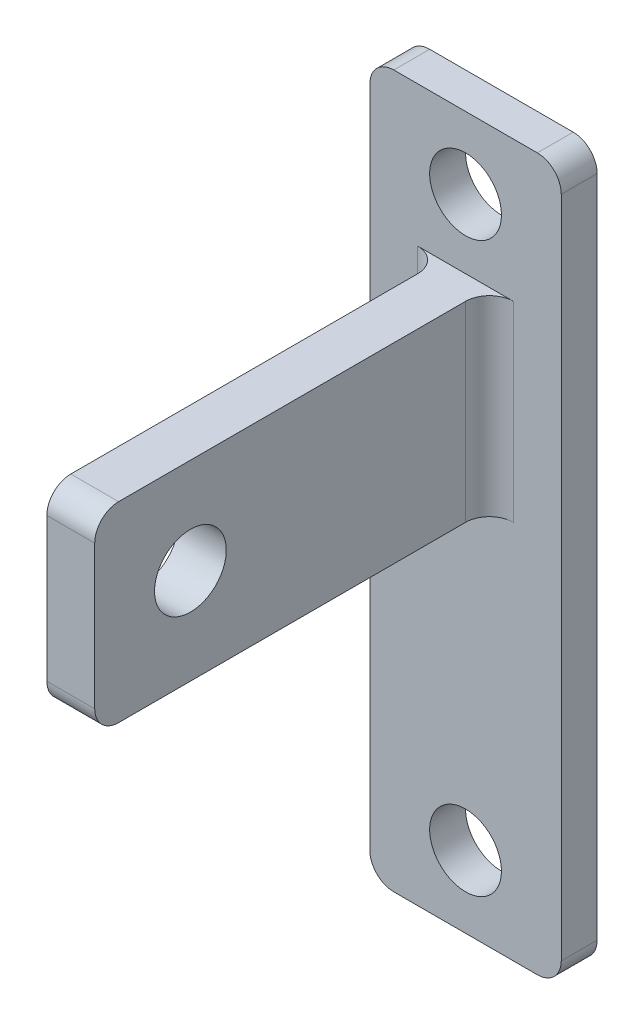
ISO-10303-21;
HEADER;
FILE_DESCRIPTION(('STEP AP214'),'2;1');
FILE_NAME('part.step','',(''),(''),'','','');
FILE_SCHEMA(('AUTOMOTIVE_DESIGN { 1 0 10303 214 1 1 1 1 }'));
ENDSEC;
DATA;
#1=APPLICATION_CONTEXT('core data for automotive mechanical design processes');
#2=APPLICATION_PROTOCOL_DEFINITION('international standard','automotive_design',2000,#1);
#3=PRODUCT_CONTEXT('',#1,'mechanical');
#4=PRODUCT('Part','Part','',(#3));
#5=PRODUCT_RELATED_PRODUCT_CATEGORY('part','',(#4));
#6=PRODUCT_DEFINITION_FORMATION('','',#4);
#7=PRODUCT_DEFINITION_CONTEXT('part definition',#1,'design');
#8=PRODUCT_DEFINITION('design','',#6,#7);
#9=PRODUCT_DEFINITION_SHAPE('','',#8);
#10=(LENGTH_UNIT() NAMED_UNIT(*) SI_UNIT(.MILLI.,.METRE.));
#11=(NAMED_UNIT(*) PLANE_ANGLE_UNIT() SI_UNIT($,.RADIAN.));
#12=(NAMED_UNIT(*) SI_UNIT($,.STERADIAN.) SOLID_ANGLE_UNIT());
#13=UNCERTAINTY_MEASURE_WITH_UNIT(LENGTH_MEASURE(1.E-05),#10,'distance_accuracy_value','');
#14=(GEOMETRIC_REPRESENTATION_CONTEXT(3) GLOBAL_UNCERTAINTY_ASSIGNED_CONTEXT((#13)) GLOBAL_UNIT_ASSIGNED_CONTEXT((#10,
#11,#12)) REPRESENTATION_CONTEXT('',''));
#15=CARTESIAN_POINT('',(0.,0.,0.));
#16=DIRECTION('',(0.,0.,1.));
#17=DIRECTION('',(1.,0.,0.));
#18=AXIS2_PLACEMENT_3D('',#15,#16,#17);
#19=CARTESIAN_POINT('',(0.,0.,1.5));
#20=DIRECTION('',(0.,0.,-1.));
#21=DIRECTION('',(-1.,0.,0.));
#22=AXIS2_PLACEMENT_3D('',#19,#20,#21);
#23=PLANE('',#22);
#24=CARTESIAN_POINT('',(0.,-11.875,1.5));
#25=DIRECTION('',(0.,0.,1.));
#26=DIRECTION('',(1.,0.,0.));
#27=AXIS2_PLACEMENT_3D('',#24,#25,#26);
#28=CIRCLE('',#27,1.5);
#29=CARTESIAN_POINT('',(1.5,-11.875,1.5));
#30=VERTEX_POINT('',#29);
#31=EDGE_CURVE('E264',#30,#30,#28,.T.);
#32=ORIENTED_EDGE('',*,*,#31,.F.);
#33=EDGE_LOOP('',(#32));
#34=FACE_BOUND('',#33,.T.);
#35=DIRECTION('',(1.,0.,0.));
#36=VECTOR('',#35,1.);
#37=CARTESIAN_POINT('',(-4.,-14.875,1.5));
#38=LINE('',#37,#36);
#39=CARTESIAN_POINT('',(-3.,-14.875,1.5));
#40=VERTEX_POINT('',#39);
#41=CARTESIAN_POINT('',(3.,-14.875,1.5));
#42=VERTEX_POINT('',#41);
#43=EDGE_CURVE('E171',#40,#42,#38,.T.);
#44=ORIENTED_EDGE('',*,*,#43,.T.);
#45=CARTESIAN_POINT('',(3.,-13.875,1.5));
#46=DIRECTION('',(0.,0.,-1.));
#47=DIRECTION('',(-1.,0.,0.));
#48=AXIS2_PLACEMENT_3D('',#45,#46,#47);
#49=CIRCLE('',#48,1.);
#50=CARTESIAN_POINT('',(4.,-13.875,1.5));
#51=VERTEX_POINT('',#50);
#52=EDGE_CURVE('E216',#42,#51,#49,.F.);
#53=ORIENTED_EDGE('',*,*,#52,.T.);
#54=DIRECTION('',(0.,1.,0.));
#55=VECTOR('',#54,1.);
#56=CARTESIAN_POINT('',(4.,-14.875,1.5));
#57=LINE('',#56,#55);
#58=CARTESIAN_POINT('',(4.,13.875,1.5));
#59=VERTEX_POINT('',#58);
#60=EDGE_CURVE('E276',#51,#59,#57,.T.);
#61=ORIENTED_EDGE('',*,*,#60,.T.);
#62=CARTESIAN_POINT('',(3.,13.875,1.5));
#63=DIRECTION('',(0.,0.,-1.));
#64=DIRECTION('',(-1.,0.,0.));
#65=AXIS2_PLACEMENT_3D('',#62,#63,#64);
#66=CIRCLE('',#65,1.);
#67=CARTESIAN_POINT('',(3.,14.875,1.5));
#68=VERTEX_POINT('',#67);
#69=EDGE_CURVE('E212',#59,#68,#66,.F.);
#70=ORIENTED_EDGE('',*,*,#69,.T.);
#71=DIRECTION('',(-1.,0.,0.));
#72=VECTOR('',#71,1.);
#73=CARTESIAN_POINT('',(-4.,14.875,1.5));
#74=LINE('',#73,#72);
#75=CARTESIAN_POINT('',(-3.,14.875,1.5));
#76=VERTEX_POINT('',#75);
#77=EDGE_CURVE('E279',#68,#76,#74,.T.);
#78=ORIENTED_EDGE('',*,*,#77,.T.);
#79=CARTESIAN_POINT('',(-3.,13.875,1.5));
#80=DIRECTION('',(0.,0.,-1.));
#81=DIRECTION('',(-1.,0.,0.));
#82=AXIS2_PLACEMENT_3D('',#79,#80,#81);
#83=CIRCLE('',#82,1.);
#84=CARTESIAN_POINT('',(-4.,13.875,1.5));
#85=VERTEX_POINT('',#84);
#86=EDGE_CURVE('E210',#76,#85,#83,.F.);
#87=ORIENTED_EDGE('',*,*,#86,.T.);
#88=DIRECTION('',(0.,-1.,0.));
#89=VECTOR('',#88,1.);
#90=CARTESIAN_POINT('',(-4.,-14.875,1.5));
#91=LINE('',#90,#89);
#92=CARTESIAN_POINT('',(-4.,-13.875,1.5));
#93=VERTEX_POINT('',#92);
#94=EDGE_CURVE('E176',#85,#93,#91,.T.);
#95=ORIENTED_EDGE('',*,*,#94,.T.);
#96=CARTESIAN_POINT('',(-3.,-13.875,1.5));
#97=DIRECTION('',(0.,0.,-1.));
#98=DIRECTION('',(-1.,0.,0.));
#99=AXIS2_PLACEMENT_3D('',#96,#97,#98);
#100=CIRCLE('',#99,1.);
#101=EDGE_CURVE('E214',#93,#40,#100,.F.);
#102=ORIENTED_EDGE('',*,*,#101,.T.);
#103=EDGE_LOOP('',(#44,#53,#61,#70,#78,#87,#95,#102));
#104=FACE_BOUND('',#103,.T.);
#105=CARTESIAN_POINT('',(0.,11.875,1.5));
#106=DIRECTION('',(0.,0.,1.));
#107=DIRECTION('',(1.,0.,0.));
#108=AXIS2_PLACEMENT_3D('',#105,#106,#107);
#109=CIRCLE('',#108,1.5);
#110=CARTESIAN_POINT('',(1.5,11.875,1.5));
#111=VERTEX_POINT('',#110);
#112=EDGE_CURVE('E270',#111,#111,#109,.T.);
#113=ORIENTED_EDGE('',*,*,#112,.F.);
#114=EDGE_LOOP('',(#113));
#115=FACE_BOUND('',#114,.T.);
#116=DIRECTION('',(1.,0.,0.));
#117=VECTOR('',#116,1.);
#118=CARTESIAN_POINT('',(-1.,1.,1.5));
#119=LINE('',#118,#117);
#120=CARTESIAN_POINT('',(-2.,1.,1.5));
#121=VERTEX_POINT('',#120);
#122=CARTESIAN_POINT('',(2.,1.,1.5));
#123=VERTEX_POINT('',#122);
#124=EDGE_CURVE('E257',#121,#123,#119,.T.);
#125=ORIENTED_EDGE('',*,*,#124,.F.);
#126=DIRECTION('',(0.,-1.,0.));
#127=VECTOR('',#126,1.);
#128=CARTESIAN_POINT('',(-2.,9.,1.5));
#129=LINE('',#128,#127);
#130=CARTESIAN_POINT('',(-2.,9.,1.5));
#131=VERTEX_POINT('',#130);
#132=EDGE_CURVE('E164',#121,#131,#129,.F.);
#133=ORIENTED_EDGE('',*,*,#132,.T.);
#134=DIRECTION('',(-1.,0.,0.));
#135=VECTOR('',#134,1.);
#136=CARTESIAN_POINT('',(-1.,9.,1.5));
#137=LINE('',#136,#135);
#138=CARTESIAN_POINT('',(2.,9.,1.5));
#139=VERTEX_POINT('',#138);
#140=EDGE_CURVE('E394',#139,#131,#137,.T.);
#141=ORIENTED_EDGE('',*,*,#140,.F.);
#142=DIRECTION('',(0.,1.,0.));
#143=VECTOR('',#142,1.);
#144=CARTESIAN_POINT('',(2.,1.,1.5));
#145=LINE('',#144,#143);
#146=EDGE_CURVE('E170',#139,#123,#145,.F.);
#147=ORIENTED_EDGE('',*,*,#146,.T.);
#148=EDGE_LOOP('',(#125,#133,#141,#147));
#149=FACE_BOUND('',#148,.T.);
#150=ADVANCED_FACE('F37',(#34,#104,#115,#149),#23,.F.);
#151=CARTESIAN_POINT('',(0.,0.,0.));
#152=DIRECTION('',(0.,0.,-1.));
#153=DIRECTION('',(-1.,0.,0.));
#154=AXIS2_PLACEMENT_3D('',#151,#152,#153);
#155=PLANE('',#154);
#156=CARTESIAN_POINT('',(0.,11.875,0.));
#157=DIRECTION('',(0.,0.,1.));
#158=DIRECTION('',(1.,0.,0.));
#159=AXIS2_PLACEMENT_3D('',#156,#157,#158);
#160=CIRCLE('',#159,1.5);
#161=CARTESIAN_POINT('',(1.5,11.875,0.));
#162=VERTEX_POINT('',#161);
#163=EDGE_CURVE('E267',#162,#162,#160,.T.);
#164=ORIENTED_EDGE('',*,*,#163,.T.);
#165=EDGE_LOOP('',(#164));
#166=FACE_BOUND('',#165,.T.);
#167=DIRECTION('',(0.,1.,0.));
#168=VECTOR('',#167,1.);
#169=CARTESIAN_POINT('',(4.,-14.875,0.));
#170=LINE('',#169,#168);
#171=CARTESIAN_POINT('',(4.,-13.875,0.));
#172=VERTEX_POINT('',#171);
#173=CARTESIAN_POINT('',(4.,13.875,0.));
#174=VERTEX_POINT('',#173);
#175=EDGE_CURVE('E273',#172,#174,#170,.T.);
#176=ORIENTED_EDGE('',*,*,#175,.F.);
#177=CARTESIAN_POINT('',(3.,-13.875,0.));
#178=DIRECTION('',(0.,0.,-1.));
#179=DIRECTION('',(-1.,0.,0.));
#180=AXIS2_PLACEMENT_3D('',#177,#178,#179);
#181=CIRCLE('',#180,1.);
#182=CARTESIAN_POINT('',(3.,-14.875,0.));
#183=VERTEX_POINT('',#182);
#184=EDGE_CURVE('E203',#172,#183,#181,.T.);
#185=ORIENTED_EDGE('',*,*,#184,.T.);
#186=DIRECTION('',(1.,0.,0.));
#187=VECTOR('',#186,1.);
#188=CARTESIAN_POINT('',(-4.,-14.875,0.));
#189=LINE('',#188,#187);
#190=CARTESIAN_POINT('',(-3.,-14.875,0.));
#191=VERTEX_POINT('',#190);
#192=EDGE_CURVE('E179',#191,#183,#189,.T.);
#193=ORIENTED_EDGE('',*,*,#192,.F.);
#194=CARTESIAN_POINT('',(-3.,-13.875,0.));
#195=DIRECTION('',(0.,0.,-1.));
#196=DIRECTION('',(-1.,0.,0.));
#197=AXIS2_PLACEMENT_3D('',#194,#195,#196);
#198=CIRCLE('',#197,1.);
#199=CARTESIAN_POINT('',(-4.,-13.875,0.));
#200=VERTEX_POINT('',#199);
#201=EDGE_CURVE('E201',#191,#200,#198,.T.);
#202=ORIENTED_EDGE('',*,*,#201,.T.);
#203=DIRECTION('',(0.,-1.,0.));
#204=VECTOR('',#203,1.);
#205=CARTESIAN_POINT('',(-4.,-14.875,0.));
#206=LINE('',#205,#204);
#207=CARTESIAN_POINT('',(-4.,13.875,0.));
#208=VERTEX_POINT('',#207);
#209=EDGE_CURVE('E288',#208,#200,#206,.T.);
#210=ORIENTED_EDGE('',*,*,#209,.F.);
#211=CARTESIAN_POINT('',(-3.,13.875,0.));
#212=DIRECTION('',(0.,0.,-1.));
#213=DIRECTION('',(-1.,0.,0.));
#214=AXIS2_PLACEMENT_3D('',#211,#212,#213);
#215=CIRCLE('',#214,1.);
#216=CARTESIAN_POINT('',(-3.,14.875,0.));
#217=VERTEX_POINT('',#216);
#218=EDGE_CURVE('E197',#208,#217,#215,.T.);
#219=ORIENTED_EDGE('',*,*,#218,.T.);
#220=DIRECTION('',(-1.,0.,0.));
#221=VECTOR('',#220,1.);
#222=CARTESIAN_POINT('',(-4.,14.875,0.));
#223=LINE('',#222,#221);
#224=CARTESIAN_POINT('',(3.,14.875,0.));
#225=VERTEX_POINT('',#224);
#226=EDGE_CURVE('E286',#225,#217,#223,.T.);
#227=ORIENTED_EDGE('',*,*,#226,.F.);
#228=CARTESIAN_POINT('',(3.,13.875,0.));
#229=DIRECTION('',(0.,0.,-1.));
#230=DIRECTION('',(-1.,0.,0.));
#231=AXIS2_PLACEMENT_3D('',#228,#229,#230);
#232=CIRCLE('',#231,1.);
#233=EDGE_CURVE('E199',#225,#174,#232,.T.);
#234=ORIENTED_EDGE('',*,*,#233,.T.);
#235=EDGE_LOOP('',(#176,#185,#193,#202,#210,#219,#227,#234));
#236=FACE_BOUND('',#235,.T.);
#237=CARTESIAN_POINT('',(0.,-11.875,0.));
#238=DIRECTION('',(0.,0.,1.));
#239=DIRECTION('',(1.,0.,0.));
#240=AXIS2_PLACEMENT_3D('',#237,#238,#239);
#241=CIRCLE('',#240,1.5);
#242=CARTESIAN_POINT('',(1.5,-11.875,0.));
#243=VERTEX_POINT('',#242);
#244=EDGE_CURVE('E263',#243,#243,#241,.T.);
#245=ORIENTED_EDGE('',*,*,#244,.T.);
#246=EDGE_LOOP('',(#245));
#247=FACE_BOUND('',#246,.T.);
#248=ADVANCED_FACE('F330',(#166,#236,#247),#155,.T.);
#249=CARTESIAN_POINT('',(4.,-14.875,1.5));
#250=DIRECTION('',(-1.,0.,0.));
#251=DIRECTION('',(0.,-1.,0.));
#252=AXIS2_PLACEMENT_3D('',#249,#250,#251);
#253=PLANE('',#252);
#254=ORIENTED_EDGE('',*,*,#60,.F.);
#255=DIRECTION('',(0.,0.,-1.));
#256=VECTOR('',#255,1.);
#257=CARTESIAN_POINT('',(4.,-13.875,1.5));
#258=LINE('',#257,#256);
#259=EDGE_CURVE('E194',#51,#172,#258,.T.);
#260=ORIENTED_EDGE('',*,*,#259,.T.);
#261=ORIENTED_EDGE('',*,*,#175,.T.);
#262=DIRECTION('',(0.,0.,-1.));
#263=VECTOR('',#262,1.);
#264=CARTESIAN_POINT('',(4.,13.875,1.5));
#265=LINE('',#264,#263);
#266=EDGE_CURVE('E192',#174,#59,#265,.F.);
#267=ORIENTED_EDGE('',*,*,#266,.T.);
#268=EDGE_LOOP('',(#254,#260,#261,#267));
#269=FACE_BOUND('',#268,.T.);
#270=ADVANCED_FACE('F310',(#269),#253,.F.);
#271=CARTESIAN_POINT('',(-4.,14.875,1.5));
#272=DIRECTION('',(0.,-1.,0.));
#273=DIRECTION('',(0.,0.,-1.));
#274=AXIS2_PLACEMENT_3D('',#271,#272,#273);
#275=PLANE('',#274);
#276=ORIENTED_EDGE('',*,*,#77,.F.);
#277=DIRECTION('',(0.,0.,-1.));
#278=VECTOR('',#277,1.);
#279=CARTESIAN_POINT('',(3.,14.875,1.5));
#280=LINE('',#279,#278);
#281=EDGE_CURVE('E225',#68,#225,#280,.T.);
#282=ORIENTED_EDGE('',*,*,#281,.T.);
#283=ORIENTED_EDGE('',*,*,#226,.T.);
#284=DIRECTION('',(0.,0.,-1.));
#285=VECTOR('',#284,1.);
#286=CARTESIAN_POINT('',(-3.,14.875,1.5));
#287=LINE('',#286,#285);
#288=EDGE_CURVE('E223',#217,#76,#287,.F.);
#289=ORIENTED_EDGE('',*,*,#288,.T.);
#290=EDGE_LOOP('',(#276,#282,#283,#289));
#291=FACE_BOUND('',#290,.T.);
#292=ADVANCED_FACE('F319',(#291),#275,.F.);
#293=CARTESIAN_POINT('',(-4.,-14.875,1.5));
#294=DIRECTION('',(1.,0.,0.));
#295=DIRECTION('',(0.,0.,-1.));
#296=AXIS2_PLACEMENT_3D('',#293,#294,#295);
#297=PLANE('',#296);
#298=ORIENTED_EDGE('',*,*,#209,.T.);
#299=DIRECTION('',(0.,0.,-1.));
#300=VECTOR('',#299,1.);
#301=CARTESIAN_POINT('',(-4.,-13.875,1.5));
#302=LINE('',#301,#300);
#303=EDGE_CURVE('E221',#200,#93,#302,.F.);
#304=ORIENTED_EDGE('',*,*,#303,.T.);
#305=ORIENTED_EDGE('',*,*,#94,.F.);
#306=DIRECTION('',(0.,0.,-1.));
#307=VECTOR('',#306,1.);
#308=CARTESIAN_POINT('',(-4.,13.875,1.5));
#309=LINE('',#308,#307);
#310=EDGE_CURVE('E218',#85,#208,#309,.T.);
#311=ORIENTED_EDGE('',*,*,#310,.T.);
#312=EDGE_LOOP('',(#298,#304,#305,#311));
#313=FACE_BOUND('',#312,.T.);
#314=ADVANCED_FACE('F327',(#313),#297,.F.);
#315=CARTESIAN_POINT('',(-4.,-14.875,1.5));
#316=DIRECTION('',(0.,1.,0.));
#317=DIRECTION('',(0.,0.,1.));
#318=AXIS2_PLACEMENT_3D('',#315,#316,#317);
#319=PLANE('',#318);
#320=ORIENTED_EDGE('',*,*,#192,.T.);
#321=DIRECTION('',(0.,0.,-1.));
#322=VECTOR('',#321,1.);
#323=CARTESIAN_POINT('',(3.,-14.875,1.5));
#324=LINE('',#323,#322);
#325=EDGE_CURVE('E208',#183,#42,#324,.F.);
#326=ORIENTED_EDGE('',*,*,#325,.T.);
#327=ORIENTED_EDGE('',*,*,#43,.F.);
#328=DIRECTION('',(0.,0.,-1.));
#329=VECTOR('',#328,1.);
#330=CARTESIAN_POINT('',(-3.,-14.875,1.5));
#331=LINE('',#330,#329);
#332=EDGE_CURVE('E205',#40,#191,#331,.T.);
#333=ORIENTED_EDGE('',*,*,#332,.T.);
#334=EDGE_LOOP('',(#320,#326,#327,#333));
#335=FACE_BOUND('',#334,.T.);
#336=ADVANCED_FACE('F297',(#335),#319,.F.);
#337=CARTESIAN_POINT('',(0.,11.875,1.5));
#338=DIRECTION('',(0.,0.,-1.));
#339=DIRECTION('',(-1.,0.,0.));
#340=AXIS2_PLACEMENT_3D('',#337,#338,#339);
#341=CYLINDRICAL_SURFACE('',#340,1.5);
#342=ORIENTED_EDGE('',*,*,#112,.T.);
#343=EDGE_LOOP('',(#342));
#344=FACE_BOUND('',#343,.T.);
#345=ORIENTED_EDGE('',*,*,#163,.F.);
#346=EDGE_LOOP('',(#345));
#347=FACE_BOUND('',#346,.T.);
#348=ADVANCED_FACE('F339',(#344,#347),#341,.F.);
#349=CARTESIAN_POINT('',(0.,-11.875,1.5));
#350=DIRECTION('',(0.,0.,-1.));
#351=DIRECTION('',(-1.,0.,0.));
#352=AXIS2_PLACEMENT_3D('',#349,#350,#351);
#353=CYLINDRICAL_SURFACE('',#352,1.5);
#354=ORIENTED_EDGE('',*,*,#31,.T.);
#355=EDGE_LOOP('',(#354));
#356=FACE_BOUND('',#355,.T.);
#357=ORIENTED_EDGE('',*,*,#244,.F.);
#358=EDGE_LOOP('',(#357));
#359=FACE_BOUND('',#358,.T.);
#360=ADVANCED_FACE('F337',(#356,#359),#353,.F.);
#361=CARTESIAN_POINT('',(1.,1.,18.));
#362=DIRECTION('',(-1.,0.,0.));
#363=DIRECTION('',(0.,-1.,0.));
#364=AXIS2_PLACEMENT_3D('',#361,#362,#363);
#365=PLANE('',#364);
#366=CARTESIAN_POINT('',(0.999999999999996,5.,14.));
#367=DIRECTION('',(-1.,0.,0.));
#368=DIRECTION('',(0.,0.,1.));
#369=AXIS2_PLACEMENT_3D('',#366,#367,#368);
#370=CIRCLE('',#369,1.5);
#371=CARTESIAN_POINT('',(0.999999999999996,5.,15.5));
#372=VERTEX_POINT('',#371);
#373=EDGE_CURVE('E398',#372,#372,#370,.T.);
#374=ORIENTED_EDGE('',*,*,#373,.T.);
#375=EDGE_LOOP('',(#374));
#376=FACE_BOUND('',#375,.T.);
#377=DIRECTION('',(0.,1.,0.));
#378=VECTOR('',#377,1.);
#379=CARTESIAN_POINT('',(1.,1.,18.));
#380=LINE('',#379,#378);
#381=CARTESIAN_POINT('',(1.,2.,18.));
#382=VERTEX_POINT('',#381);
#383=CARTESIAN_POINT('',(1.,8.,18.));
#384=VERTEX_POINT('',#383);
#385=EDGE_CURVE('E248',#382,#384,#380,.T.);
#386=ORIENTED_EDGE('',*,*,#385,.F.);
#387=CARTESIAN_POINT('',(1.,2.,17.));
#388=DIRECTION('',(-1.,0.,0.));
#389=DIRECTION('',(0.,-1.,0.));
#390=AXIS2_PLACEMENT_3D('',#387,#388,#389);
#391=CIRCLE('',#390,1.);
#392=CARTESIAN_POINT('',(1.,1.,17.));
#393=VERTEX_POINT('',#392);
#394=EDGE_CURVE('E236',#382,#393,#391,.F.);
#395=ORIENTED_EDGE('',*,*,#394,.T.);
#396=DIRECTION('',(0.,0.,-1.));
#397=VECTOR('',#396,1.);
#398=CARTESIAN_POINT('',(1.,1.,18.));
#399=LINE('',#398,#397);
#400=CARTESIAN_POINT('',(1.,1.,2.5));
#401=VERTEX_POINT('',#400);
#402=EDGE_CURVE('E156',#393,#401,#399,.T.);
#403=ORIENTED_EDGE('',*,*,#402,.T.);
#404=DIRECTION('',(0.,1.,0.));
#405=VECTOR('',#404,1.);
#406=CARTESIAN_POINT('',(1.,9.,2.5));
#407=LINE('',#406,#405);
#408=CARTESIAN_POINT('',(1.,9.,2.5));
#409=VERTEX_POINT('',#408);
#410=EDGE_CURVE('E166',#401,#409,#407,.T.);
#411=ORIENTED_EDGE('',*,*,#410,.T.);
#412=DIRECTION('',(0.,0.,-1.));
#413=VECTOR('',#412,1.);
#414=CARTESIAN_POINT('',(1.,9.,18.));
#415=LINE('',#414,#413);
#416=CARTESIAN_POINT('',(1.,9.,17.));
#417=VERTEX_POINT('',#416);
#418=EDGE_CURVE('E261',#417,#409,#415,.T.);
#419=ORIENTED_EDGE('',*,*,#418,.F.);
#420=CARTESIAN_POINT('',(1.,8.,17.));
#421=DIRECTION('',(-1.,0.,0.));
#422=DIRECTION('',(0.,-1.,0.));
#423=AXIS2_PLACEMENT_3D('',#420,#421,#422);
#424=CIRCLE('',#423,1.);
#425=EDGE_CURVE('E234',#417,#384,#424,.F.);
#426=ORIENTED_EDGE('',*,*,#425,.T.);
#427=EDGE_LOOP('',(#386,#395,#403,#411,#419,#426));
#428=FACE_BOUND('',#427,.T.);
#429=ADVANCED_FACE('F252',(#376,#428),#365,.F.);
#430=CARTESIAN_POINT('',(-1.,9.,18.));
#431=DIRECTION('',(0.,-1.,0.));
#432=DIRECTION('',(0.,0.,-1.));
#433=AXIS2_PLACEMENT_3D('',#430,#431,#432);
#434=PLANE('',#433);
#435=DIRECTION('',(0.,0.,-1.));
#436=VECTOR('',#435,1.);
#437=CARTESIAN_POINT('',(-1.,9.,18.));
#438=LINE('',#437,#436);
#439=CARTESIAN_POINT('',(-1.,9.,17.));
#440=VERTEX_POINT('',#439);
#441=CARTESIAN_POINT('',(-1.,9.,2.5));
#442=VERTEX_POINT('',#441);
#443=EDGE_CURVE('E155',#440,#442,#438,.T.);
#444=ORIENTED_EDGE('',*,*,#443,.F.);
#445=DIRECTION('',(-1.,0.,0.));
#446=VECTOR('',#445,1.);
#447=CARTESIAN_POINT('',(-1.,9.,17.));
#448=LINE('',#447,#446);
#449=EDGE_CURVE('E11',#440,#417,#448,.F.);
#450=ORIENTED_EDGE('',*,*,#449,.T.);
#451=ORIENTED_EDGE('',*,*,#418,.T.);
#452=CARTESIAN_POINT('',(2.,9.,2.5));
#453=DIRECTION('',(0.,-1.,0.));
#454=DIRECTION('',(0.,0.,-1.));
#455=AXIS2_PLACEMENT_3D('',#452,#453,#454);
#456=CIRCLE('',#455,1.);
#457=EDGE_CURVE('E186',#409,#139,#456,.T.);
#458=ORIENTED_EDGE('',*,*,#457,.T.);
#459=ORIENTED_EDGE('',*,*,#140,.T.);
#460=CARTESIAN_POINT('',(-2.,9.,2.5));
#461=DIRECTION('',(0.,-1.,0.));
#462=DIRECTION('',(0.,0.,-1.));
#463=AXIS2_PLACEMENT_3D('',#460,#461,#462);
#464=CIRCLE('',#463,1.);
#465=EDGE_CURVE('E165',#131,#442,#464,.T.);
#466=ORIENTED_EDGE('',*,*,#465,.T.);
#467=EDGE_LOOP('',(#444,#450,#451,#458,#459,#466));
#468=FACE_BOUND('',#467,.T.);
#469=ADVANCED_FACE('F346',(#468),#434,.F.);
#470=CARTESIAN_POINT('',(-1.,1.,18.));
#471=DIRECTION('',(1.,0.,0.));
#472=DIRECTION('',(0.,0.,-1.));
#473=AXIS2_PLACEMENT_3D('',#470,#471,#472);
#474=PLANE('',#473);
#475=CARTESIAN_POINT('',(-1.,5.,14.));
#476=DIRECTION('',(-1.,0.,0.));
#477=DIRECTION('',(0.,0.,1.));
#478=AXIS2_PLACEMENT_3D('',#475,#476,#477);
#479=CIRCLE('',#478,1.5);
#480=CARTESIAN_POINT('',(-1.,5.,15.5));
#481=VERTEX_POINT('',#480);
#482=EDGE_CURVE('E396',#481,#481,#479,.T.);
#483=ORIENTED_EDGE('',*,*,#482,.F.);
#484=EDGE_LOOP('',(#483));
#485=FACE_BOUND('',#484,.T.);
#486=DIRECTION('',(0.,0.,-1.));
#487=VECTOR('',#486,1.);
#488=CARTESIAN_POINT('',(-1.,1.,18.));
#489=LINE('',#488,#487);
#490=CARTESIAN_POINT('',(-1.,1.,17.));
#491=VERTEX_POINT('',#490);
#492=CARTESIAN_POINT('',(-1.,1.,2.5));
#493=VERTEX_POINT('',#492);
#494=EDGE_CURVE('E148',#491,#493,#489,.T.);
#495=ORIENTED_EDGE('',*,*,#494,.F.);
#496=CARTESIAN_POINT('',(-1.,2.,17.));
#497=DIRECTION('',(1.,0.,0.));
#498=DIRECTION('',(0.,0.,-1.));
#499=AXIS2_PLACEMENT_3D('',#496,#497,#498);
#500=CIRCLE('',#499,1.);
#501=CARTESIAN_POINT('',(-1.,2.,18.));
#502=VERTEX_POINT('',#501);
#503=EDGE_CURVE('E45',#491,#502,#500,.F.);
#504=ORIENTED_EDGE('',*,*,#503,.T.);
#505=DIRECTION('',(0.,-1.,0.));
#506=VECTOR('',#505,1.);
#507=CARTESIAN_POINT('',(-1.,1.,18.));
#508=LINE('',#507,#506);
#509=CARTESIAN_POINT('',(-1.,8.,18.));
#510=VERTEX_POINT('',#509);
#511=EDGE_CURVE('E240',#510,#502,#508,.T.);
#512=ORIENTED_EDGE('',*,*,#511,.F.);
#513=CARTESIAN_POINT('',(-1.,8.,17.));
#514=DIRECTION('',(1.,0.,0.));
#515=DIRECTION('',(0.,0.,-1.));
#516=AXIS2_PLACEMENT_3D('',#513,#514,#515);
#517=CIRCLE('',#516,1.);
#518=EDGE_CURVE('E52',#510,#440,#517,.F.);
#519=ORIENTED_EDGE('',*,*,#518,.T.);
#520=ORIENTED_EDGE('',*,*,#443,.T.);
#521=DIRECTION('',(0.,-1.,0.));
#522=VECTOR('',#521,1.);
#523=CARTESIAN_POINT('',(-1.,1.,2.5));
#524=LINE('',#523,#522);
#525=EDGE_CURVE('E162',#442,#493,#524,.T.);
#526=ORIENTED_EDGE('',*,*,#525,.T.);
#527=EDGE_LOOP('',(#495,#504,#512,#519,#520,#526));
#528=FACE_BOUND('',#527,.T.);
#529=ADVANCED_FACE('F168',(#485,#528),#474,.F.);
#530=CARTESIAN_POINT('',(-1.,1.,18.));
#531=DIRECTION('',(0.,1.,0.));
#532=DIRECTION('',(-1.,0.,0.));
#533=AXIS2_PLACEMENT_3D('',#530,#531,#532);
#534=PLANE('',#533);
#535=ORIENTED_EDGE('',*,*,#402,.F.);
#536=DIRECTION('',(1.,0.,0.));
#537=VECTOR('',#536,1.);
#538=CARTESIAN_POINT('',(-1.,1.,17.));
#539=LINE('',#538,#537);
#540=EDGE_CURVE('E60',#393,#491,#539,.F.);
#541=ORIENTED_EDGE('',*,*,#540,.T.);
#542=ORIENTED_EDGE('',*,*,#494,.T.);
#543=CARTESIAN_POINT('',(-2.,1.,2.5));
#544=DIRECTION('',(0.,1.,0.));
#545=DIRECTION('',(-1.,0.,0.));
#546=AXIS2_PLACEMENT_3D('',#543,#544,#545);
#547=CIRCLE('',#546,1.);
#548=EDGE_CURVE('E151',#493,#121,#547,.T.);
#549=ORIENTED_EDGE('',*,*,#548,.T.);
#550=ORIENTED_EDGE('',*,*,#124,.T.);
#551=CARTESIAN_POINT('',(2.,1.,2.5));
#552=DIRECTION('',(0.,1.,0.));
#553=DIRECTION('',(-1.,0.,0.));
#554=AXIS2_PLACEMENT_3D('',#551,#552,#553);
#555=CIRCLE('',#554,1.);
#556=EDGE_CURVE('E189',#123,#401,#555,.T.);
#557=ORIENTED_EDGE('',*,*,#556,.T.);
#558=EDGE_LOOP('',(#535,#541,#542,#549,#550,#557));
#559=FACE_BOUND('',#558,.T.);
#560=ADVANCED_FACE('F150',(#559),#534,.F.);
#561=CARTESIAN_POINT('',(0.,0.,18.));
#562=DIRECTION('',(0.,0.,-1.));
#563=DIRECTION('',(-1.,0.,0.));
#564=AXIS2_PLACEMENT_3D('',#561,#562,#563);
#565=PLANE('',#564);
#566=ORIENTED_EDGE('',*,*,#511,.T.);
#567=DIRECTION('',(1.,0.,0.));
#568=VECTOR('',#567,1.);
#569=CARTESIAN_POINT('',(0.,2.,18.));
#570=LINE('',#569,#568);
#571=EDGE_CURVE('E231',#502,#382,#570,.T.);
#572=ORIENTED_EDGE('',*,*,#571,.T.);
#573=ORIENTED_EDGE('',*,*,#385,.T.);
#574=DIRECTION('',(-1.,0.,0.));
#575=VECTOR('',#574,1.);
#576=CARTESIAN_POINT('',(0.,8.,18.));
#577=LINE('',#576,#575);
#578=EDGE_CURVE('E228',#384,#510,#577,.T.);
#579=ORIENTED_EDGE('',*,*,#578,.T.);
#580=EDGE_LOOP('',(#566,#572,#573,#579));
#581=FACE_BOUND('',#580,.T.);
#582=ADVANCED_FACE('F244',(#581),#565,.F.);
#583=CARTESIAN_POINT('',(-2.,1.,2.5));
#584=DIRECTION('',(0.,1.,0.));
#585=DIRECTION('',(0.,0.,1.));
#586=AXIS2_PLACEMENT_3D('',#583,#584,#585);
#587=CYLINDRICAL_SURFACE('',#586,1.);
#588=ORIENTED_EDGE('',*,*,#465,.F.);
#589=ORIENTED_EDGE('',*,*,#132,.F.);
#590=ORIENTED_EDGE('',*,*,#548,.F.);
#591=ORIENTED_EDGE('',*,*,#525,.F.);
#592=EDGE_LOOP('',(#588,#589,#590,#591));
#593=FACE_BOUND('',#592,.T.);
#594=ADVANCED_FACE('F161',(#593),#587,.F.);
#595=CARTESIAN_POINT('',(2.,1.,2.5));
#596=DIRECTION('',(0.,-1.,0.));
#597=DIRECTION('',(1.,0.,0.));
#598=AXIS2_PLACEMENT_3D('',#595,#596,#597);
#599=CYLINDRICAL_SURFACE('',#598,1.);
#600=ORIENTED_EDGE('',*,*,#556,.F.);
#601=ORIENTED_EDGE('',*,*,#146,.F.);
#602=ORIENTED_EDGE('',*,*,#457,.F.);
#603=ORIENTED_EDGE('',*,*,#410,.F.);
#604=EDGE_LOOP('',(#600,#601,#602,#603));
#605=FACE_BOUND('',#604,.T.);
#606=ADVANCED_FACE('F368',(#605),#599,.F.);
#607=CARTESIAN_POINT('',(3.,-13.875,1.5));
#608=DIRECTION('',(0.,0.,-1.));
#609=DIRECTION('',(-1.,0.,0.));
#610=AXIS2_PLACEMENT_3D('',#607,#608,#609);
#611=CYLINDRICAL_SURFACE('',#610,1.);
#612=ORIENTED_EDGE('',*,*,#52,.F.);
#613=ORIENTED_EDGE('',*,*,#325,.F.);
#614=ORIENTED_EDGE('',*,*,#184,.F.);
#615=ORIENTED_EDGE('',*,*,#259,.F.);
#616=EDGE_LOOP('',(#612,#613,#614,#615));
#617=FACE_BOUND('',#616,.T.);
#618=ADVANCED_FACE('F303',(#617),#611,.T.);
#619=CARTESIAN_POINT('',(-3.,-13.875,1.5));
#620=DIRECTION('',(0.,0.,-1.));
#621=DIRECTION('',(-1.,0.,0.));
#622=AXIS2_PLACEMENT_3D('',#619,#620,#621);
#623=CYLINDRICAL_SURFACE('',#622,1.);
#624=ORIENTED_EDGE('',*,*,#101,.F.);
#625=ORIENTED_EDGE('',*,*,#303,.F.);
#626=ORIENTED_EDGE('',*,*,#201,.F.);
#627=ORIENTED_EDGE('',*,*,#332,.F.);
#628=EDGE_LOOP('',(#624,#625,#626,#627));
#629=FACE_BOUND('',#628,.T.);
#630=ADVANCED_FACE('F329',(#629),#623,.T.);
#631=CARTESIAN_POINT('',(3.,13.875,1.5));
#632=DIRECTION('',(0.,0.,-1.));
#633=DIRECTION('',(-1.,0.,0.));
#634=AXIS2_PLACEMENT_3D('',#631,#632,#633);
#635=CYLINDRICAL_SURFACE('',#634,1.);
#636=ORIENTED_EDGE('',*,*,#69,.F.);
#637=ORIENTED_EDGE('',*,*,#266,.F.);
#638=ORIENTED_EDGE('',*,*,#233,.F.);
#639=ORIENTED_EDGE('',*,*,#281,.F.);
#640=EDGE_LOOP('',(#636,#637,#638,#639));
#641=FACE_BOUND('',#640,.T.);
#642=ADVANCED_FACE('F314',(#641),#635,.T.);
#643=CARTESIAN_POINT('',(-3.,13.875,1.5));
#644=DIRECTION('',(0.,0.,-1.));
#645=DIRECTION('',(-1.,0.,0.));
#646=AXIS2_PLACEMENT_3D('',#643,#644,#645);
#647=CYLINDRICAL_SURFACE('',#646,1.);
#648=ORIENTED_EDGE('',*,*,#86,.F.);
#649=ORIENTED_EDGE('',*,*,#288,.F.);
#650=ORIENTED_EDGE('',*,*,#218,.F.);
#651=ORIENTED_EDGE('',*,*,#310,.F.);
#652=EDGE_LOOP('',(#648,#649,#650,#651));
#653=FACE_BOUND('',#652,.T.);
#654=ADVANCED_FACE('F323',(#653),#647,.T.);
#655=CARTESIAN_POINT('',(0.,2.,17.));
#656=DIRECTION('',(1.,0.,0.));
#657=DIRECTION('',(0.,1.,0.));
#658=AXIS2_PLACEMENT_3D('',#655,#656,#657);
#659=CYLINDRICAL_SURFACE('',#658,1.);
#660=ORIENTED_EDGE('',*,*,#503,.F.);
#661=ORIENTED_EDGE('',*,*,#540,.F.);
#662=ORIENTED_EDGE('',*,*,#394,.F.);
#663=ORIENTED_EDGE('',*,*,#571,.F.);
#664=EDGE_LOOP('',(#660,#661,#662,#663));
#665=FACE_BOUND('',#664,.T.);
#666=ADVANCED_FACE('F250',(#665),#659,.T.);
#667=CARTESIAN_POINT('',(0.,8.,17.));
#668=DIRECTION('',(-1.,0.,0.));
#669=DIRECTION('',(0.,0.,1.));
#670=AXIS2_PLACEMENT_3D('',#667,#668,#669);
#671=CYLINDRICAL_SURFACE('',#670,1.);
#672=ORIENTED_EDGE('',*,*,#425,.F.);
#673=ORIENTED_EDGE('',*,*,#449,.F.);
#674=ORIENTED_EDGE('',*,*,#518,.F.);
#675=ORIENTED_EDGE('',*,*,#578,.F.);
#676=EDGE_LOOP('',(#672,#673,#674,#675));
#677=FACE_BOUND('',#676,.T.);
#678=ADVANCED_FACE('F39',(#677),#671,.T.);
#679=CARTESIAN_POINT('',(0.999999999999996,5.,14.));
#680=DIRECTION('',(-1.,0.,0.));
#681=DIRECTION('',(0.,0.,1.));
#682=AXIS2_PLACEMENT_3D('',#679,#680,#681);
#683=CYLINDRICAL_SURFACE('',#682,1.5);
#684=ORIENTED_EDGE('',*,*,#373,.F.);
#685=EDGE_LOOP('',(#684));
#686=FACE_BOUND('',#685,.T.);
#687=ORIENTED_EDGE('',*,*,#482,.T.);
#688=EDGE_LOOP('',(#687));
#689=FACE_BOUND('',#688,.T.);
#690=ADVANCED_FACE('F383',(#686,#689),#683,.F.);
#691=CLOSED_SHELL('',(#150,#248,#270,#292,#314,#336,#348,#360,#429,#469,#529,#560,#582,#594,
#606,#618,#630,#642,#654,#666,#678,#690));
#692=MANIFOLD_SOLID_BREP('B2',#691);
#693=ADVANCED_BREP_SHAPE_REPRESENTATION('',(#18,#692),#14);
#694=SHAPE_DEFINITION_REPRESENTATION(#9,#693);
ENDSEC;
END-ISO-10303-21;
